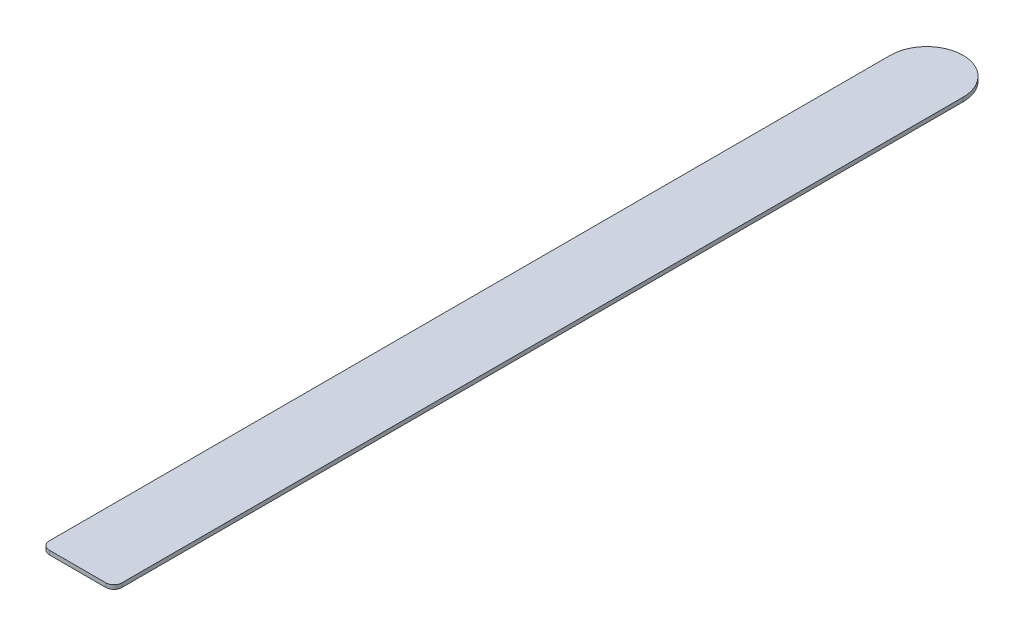
ISO-10303-21;
HEADER;
FILE_DESCRIPTION(('STEP AP214'),'2;1');
FILE_NAME('part.step','',(''),(''),'','','');
FILE_SCHEMA(('AUTOMOTIVE_DESIGN { 1 0 10303 214 1 1 1 1 }'));
ENDSEC;
DATA;
#1=APPLICATION_CONTEXT('core data for automotive mechanical design processes');
#2=APPLICATION_PROTOCOL_DEFINITION('international standard','automotive_design',2000,#1);
#3=PRODUCT_CONTEXT('',#1,'mechanical');
#4=PRODUCT('Part','Part','',(#3));
#5=PRODUCT_RELATED_PRODUCT_CATEGORY('part','',(#4));
#6=PRODUCT_DEFINITION_FORMATION('','',#4);
#7=PRODUCT_DEFINITION_CONTEXT('part definition',#1,'design');
#8=PRODUCT_DEFINITION('design','',#6,#7);
#9=PRODUCT_DEFINITION_SHAPE('','',#8);
#10=(LENGTH_UNIT() NAMED_UNIT(*) SI_UNIT(.MILLI.,.METRE.));
#11=(NAMED_UNIT(*) PLANE_ANGLE_UNIT() SI_UNIT($,.RADIAN.));
#12=(NAMED_UNIT(*) SI_UNIT($,.STERADIAN.) SOLID_ANGLE_UNIT());
#13=UNCERTAINTY_MEASURE_WITH_UNIT(LENGTH_MEASURE(1.E-05),#10,'distance_accuracy_value','');
#14=(GEOMETRIC_REPRESENTATION_CONTEXT(3) GLOBAL_UNCERTAINTY_ASSIGNED_CONTEXT((#13)) GLOBAL_UNIT_ASSIGNED_CONTEXT((#10,
#11,#12)) REPRESENTATION_CONTEXT('',''));
#15=CARTESIAN_POINT('',(0.,0.,0.));
#16=DIRECTION('',(0.,0.,1.));
#17=DIRECTION('',(1.,0.,0.));
#18=AXIS2_PLACEMENT_3D('',#15,#16,#17);
#19=CARTESIAN_POINT('',(44.7,5.,0.));
#20=DIRECTION('',(-1.,0.,0.));
#21=DIRECTION('',(0.,0.,1.));
#22=AXIS2_PLACEMENT_3D('',#19,#20,#21);
#23=PLANE('',#22);
#24=DIRECTION('',(0.,0.,-1.));
#25=VECTOR('',#24,1.);
#26=CARTESIAN_POINT('',(44.7,5.,0.));
#27=LINE('',#26,#25);
#28=CARTESIAN_POINT('',(44.6999999999999,5.,1034.7));
#29=VERTEX_POINT('',#28);
#30=CARTESIAN_POINT('',(44.7,5.,0.));
#31=VERTEX_POINT('',#30);
#32=EDGE_CURVE('E90',#29,#31,#27,.T.);
#33=ORIENTED_EDGE('',*,*,#32,.F.);
#34=DIRECTION('',(0.,-1.,0.));
#35=VECTOR('',#34,1.);
#36=CARTESIAN_POINT('',(44.6999999999999,5.,1034.7));
#37=LINE('',#36,#35);
#38=CARTESIAN_POINT('',(44.6999999999999,0.,1034.7));
#39=VERTEX_POINT('',#38);
#40=EDGE_CURVE('E11',#29,#39,#37,.T.);
#41=ORIENTED_EDGE('',*,*,#40,.T.);
#42=DIRECTION('',(0.,0.,-1.));
#43=VECTOR('',#42,1.);
#44=CARTESIAN_POINT('',(44.7,0.,0.));
#45=LINE('',#44,#43);
#46=CARTESIAN_POINT('',(44.7,0.,0.));
#47=VERTEX_POINT('',#46);
#48=EDGE_CURVE('E109',#39,#47,#45,.T.);
#49=ORIENTED_EDGE('',*,*,#48,.T.);
#50=DIRECTION('',(0.,-1.,0.));
#51=VECTOR('',#50,1.);
#52=CARTESIAN_POINT('',(44.7,5.,0.));
#53=LINE('',#52,#51);
#54=EDGE_CURVE('E103',#31,#47,#53,.T.);
#55=ORIENTED_EDGE('',*,*,#54,.F.);
#56=EDGE_LOOP('',(#33,#41,#49,#55));
#57=FACE_BOUND('',#56,.T.);
#58=ADVANCED_FACE('F37',(#57),#23,.F.);
#59=CARTESIAN_POINT('',(0.,5.,0.));
#60=DIRECTION('',(0.,-1.,0.));
#61=DIRECTION('',(0.,0.,-1.));
#62=AXIS2_PLACEMENT_3D('',#59,#60,#61);
#63=CYLINDRICAL_SURFACE('',#62,44.7);
#64=CARTESIAN_POINT('',(0.,0.,0.));
#65=DIRECTION('',(0.,1.,0.));
#66=DIRECTION('',(0.,0.,1.));
#67=AXIS2_PLACEMENT_3D('',#64,#65,#66);
#68=CIRCLE('',#67,44.7);
#69=CARTESIAN_POINT('',(-44.7,0.,0.));
#70=VERTEX_POINT('',#69);
#71=EDGE_CURVE('E142',#47,#70,#68,.T.);
#72=ORIENTED_EDGE('',*,*,#71,.T.);
#73=DIRECTION('',(0.,-1.,0.));
#74=VECTOR('',#73,1.);
#75=CARTESIAN_POINT('',(-44.7,5.,0.));
#76=LINE('',#75,#74);
#77=CARTESIAN_POINT('',(-44.7,5.,0.));
#78=VERTEX_POINT('',#77);
#79=EDGE_CURVE('E105',#78,#70,#76,.T.);
#80=ORIENTED_EDGE('',*,*,#79,.F.);
#81=CARTESIAN_POINT('',(0.,5.,0.));
#82=DIRECTION('',(0.,1.,0.));
#83=DIRECTION('',(0.,0.,1.));
#84=AXIS2_PLACEMENT_3D('',#81,#82,#83);
#85=CIRCLE('',#84,44.7);
#86=EDGE_CURVE('E93',#31,#78,#85,.T.);
#87=ORIENTED_EDGE('',*,*,#86,.F.);
#88=ORIENTED_EDGE('',*,*,#54,.T.);
#89=EDGE_LOOP('',(#72,#80,#87,#88));
#90=FACE_BOUND('',#89,.T.);
#91=ADVANCED_FACE('F102',(#90),#63,.T.);
#92=CARTESIAN_POINT('',(-44.7,5.,0.));
#93=DIRECTION('',(1.,0.,0.));
#94=DIRECTION('',(0.,0.,-1.));
#95=AXIS2_PLACEMENT_3D('',#92,#93,#94);
#96=PLANE('',#95);
#97=DIRECTION('',(0.,0.,1.));
#98=VECTOR('',#97,1.);
#99=CARTESIAN_POINT('',(-44.7,0.,0.));
#100=LINE('',#99,#98);
#101=CARTESIAN_POINT('',(-44.6999999999999,0.,1034.7));
#102=VERTEX_POINT('',#101);
#103=EDGE_CURVE('E140',#70,#102,#100,.T.);
#104=ORIENTED_EDGE('',*,*,#103,.T.);
#105=DIRECTION('',(0.,-1.,0.));
#106=VECTOR('',#105,1.);
#107=CARTESIAN_POINT('',(-44.6999999999999,5.,1034.7));
#108=LINE('',#107,#106);
#109=CARTESIAN_POINT('',(-44.6999999999999,5.,1034.7));
#110=VERTEX_POINT('',#109);
#111=EDGE_CURVE('E60',#102,#110,#108,.F.);
#112=ORIENTED_EDGE('',*,*,#111,.T.);
#113=DIRECTION('',(0.,0.,1.));
#114=VECTOR('',#113,1.);
#115=CARTESIAN_POINT('',(-44.7,5.,0.));
#116=LINE('',#115,#114);
#117=EDGE_CURVE('E106',#78,#110,#116,.T.);
#118=ORIENTED_EDGE('',*,*,#117,.F.);
#119=ORIENTED_EDGE('',*,*,#79,.T.);
#120=EDGE_LOOP('',(#104,#112,#118,#119));
#121=FACE_BOUND('',#120,.T.);
#122=ADVANCED_FACE('F141',(#121),#96,.F.);
#123=CARTESIAN_POINT('',(0.,5.,1044.7));
#124=DIRECTION('',(0.,0.,-1.));
#125=DIRECTION('',(-1.,0.,0.));
#126=AXIS2_PLACEMENT_3D('',#123,#124,#125);
#127=PLANE('',#126);
#128=DIRECTION('',(1.,0.,0.));
#129=VECTOR('',#128,1.);
#130=CARTESIAN_POINT('',(0.,5.,1044.7));
#131=LINE('',#130,#129);
#132=CARTESIAN_POINT('',(-34.6999999999999,5.,1044.7));
#133=VERTEX_POINT('',#132);
#134=CARTESIAN_POINT('',(34.6999999999999,5.,1044.7));
#135=VERTEX_POINT('',#134);
#136=EDGE_CURVE('E115',#133,#135,#131,.T.);
#137=ORIENTED_EDGE('',*,*,#136,.F.);
#138=DIRECTION('',(0.,-1.,0.));
#139=VECTOR('',#138,1.);
#140=CARTESIAN_POINT('',(-34.6999999999999,5.,1044.7));
#141=LINE('',#140,#139);
#142=CARTESIAN_POINT('',(-34.6999999999999,0.,1044.7));
#143=VERTEX_POINT('',#142);
#144=EDGE_CURVE('E113',#133,#143,#141,.T.);
#145=ORIENTED_EDGE('',*,*,#144,.T.);
#146=DIRECTION('',(1.,0.,0.));
#147=VECTOR('',#146,1.);
#148=CARTESIAN_POINT('',(0.,0.,1044.7));
#149=LINE('',#148,#147);
#150=CARTESIAN_POINT('',(34.6999999999999,0.,1044.7));
#151=VERTEX_POINT('',#150);
#152=EDGE_CURVE('E98',#143,#151,#149,.T.);
#153=ORIENTED_EDGE('',*,*,#152,.T.);
#154=DIRECTION('',(0.,-1.,0.));
#155=VECTOR('',#154,1.);
#156=CARTESIAN_POINT('',(34.6999999999999,5.,1044.7));
#157=LINE('',#156,#155);
#158=EDGE_CURVE('E111',#151,#135,#157,.F.);
#159=ORIENTED_EDGE('',*,*,#158,.T.);
#160=EDGE_LOOP('',(#137,#145,#153,#159));
#161=FACE_BOUND('',#160,.T.);
#162=ADVANCED_FACE('F131',(#161),#127,.F.);
#163=CARTESIAN_POINT('',(0.,5.,0.));
#164=DIRECTION('',(0.,1.,0.));
#165=DIRECTION('',(0.,0.,1.));
#166=AXIS2_PLACEMENT_3D('',#163,#164,#165);
#167=PLANE('',#166);
#168=ORIENTED_EDGE('',*,*,#117,.T.);
#169=CARTESIAN_POINT('',(-34.6999999999999,5.,1034.7));
#170=DIRECTION('',(0.,1.,0.));
#171=DIRECTION('',(0.,0.,1.));
#172=AXIS2_PLACEMENT_3D('',#169,#170,#171);
#173=CIRCLE('',#172,10.);
#174=EDGE_CURVE('E45',#110,#133,#173,.T.);
#175=ORIENTED_EDGE('',*,*,#174,.T.);
#176=ORIENTED_EDGE('',*,*,#136,.T.);
#177=CARTESIAN_POINT('',(34.6999999999999,5.,1034.7));
#178=DIRECTION('',(0.,1.,0.));
#179=DIRECTION('',(0.,0.,1.));
#180=AXIS2_PLACEMENT_3D('',#177,#178,#179);
#181=CIRCLE('',#180,10.);
#182=EDGE_CURVE('E52',#135,#29,#181,.T.);
#183=ORIENTED_EDGE('',*,*,#182,.T.);
#184=ORIENTED_EDGE('',*,*,#32,.T.);
#185=ORIENTED_EDGE('',*,*,#86,.T.);
#186=EDGE_LOOP('',(#168,#175,#176,#183,#184,#185));
#187=FACE_BOUND('',#186,.T.);
#188=ADVANCED_FACE('F92',(#187),#167,.T.);
#189=CARTESIAN_POINT('',(0.,0.,0.));
#190=DIRECTION('',(0.,1.,0.));
#191=DIRECTION('',(0.,0.,1.));
#192=AXIS2_PLACEMENT_3D('',#189,#190,#191);
#193=PLANE('',#192);
#194=ORIENTED_EDGE('',*,*,#152,.F.);
#195=CARTESIAN_POINT('',(-34.6999999999999,0.,1034.7));
#196=DIRECTION('',(0.,1.,0.));
#197=DIRECTION('',(0.,0.,1.));
#198=AXIS2_PLACEMENT_3D('',#195,#196,#197);
#199=CIRCLE('',#198,10.);
#200=EDGE_CURVE('E123',#143,#102,#199,.F.);
#201=ORIENTED_EDGE('',*,*,#200,.T.);
#202=ORIENTED_EDGE('',*,*,#103,.F.);
#203=ORIENTED_EDGE('',*,*,#71,.F.);
#204=ORIENTED_EDGE('',*,*,#48,.F.);
#205=CARTESIAN_POINT('',(34.6999999999999,0.,1034.7));
#206=DIRECTION('',(0.,1.,0.));
#207=DIRECTION('',(0.,0.,1.));
#208=AXIS2_PLACEMENT_3D('',#205,#206,#207);
#209=CIRCLE('',#208,10.);
#210=EDGE_CURVE('E121',#39,#151,#209,.F.);
#211=ORIENTED_EDGE('',*,*,#210,.T.);
#212=EDGE_LOOP('',(#194,#201,#202,#203,#204,#211));
#213=FACE_BOUND('',#212,.T.);
#214=ADVANCED_FACE('F139',(#213),#193,.F.);
#215=CARTESIAN_POINT('',(-34.6999999999999,5.,1034.7));
#216=DIRECTION('',(0.,-1.,0.));
#217=DIRECTION('',(0.,0.,-1.));
#218=AXIS2_PLACEMENT_3D('',#215,#216,#217);
#219=CYLINDRICAL_SURFACE('',#218,10.);
#220=ORIENTED_EDGE('',*,*,#174,.F.);
#221=ORIENTED_EDGE('',*,*,#111,.F.);
#222=ORIENTED_EDGE('',*,*,#200,.F.);
#223=ORIENTED_EDGE('',*,*,#144,.F.);
#224=EDGE_LOOP('',(#220,#221,#222,#223));
#225=FACE_BOUND('',#224,.T.);
#226=ADVANCED_FACE('F136',(#225),#219,.T.);
#227=CARTESIAN_POINT('',(34.6999999999999,5.,1034.7));
#228=DIRECTION('',(0.,-1.,0.));
#229=DIRECTION('',(0.,0.,-1.));
#230=AXIS2_PLACEMENT_3D('',#227,#228,#229);
#231=CYLINDRICAL_SURFACE('',#230,10.);
#232=ORIENTED_EDGE('',*,*,#182,.F.);
#233=ORIENTED_EDGE('',*,*,#158,.F.);
#234=ORIENTED_EDGE('',*,*,#210,.F.);
#235=ORIENTED_EDGE('',*,*,#40,.F.);
#236=EDGE_LOOP('',(#232,#233,#234,#235));
#237=FACE_BOUND('',#236,.T.);
#238=ADVANCED_FACE('F39',(#237),#231,.T.);
#239=CLOSED_SHELL('',(#58,#91,#122,#162,#188,#214,#226,#238));
#240=MANIFOLD_SOLID_BREP('B2',#239);
#241=ADVANCED_BREP_SHAPE_REPRESENTATION('',(#18,#240),#14);
#242=SHAPE_DEFINITION_REPRESENTATION(#9,#241);
ENDSEC;
END-ISO-10303-21;
